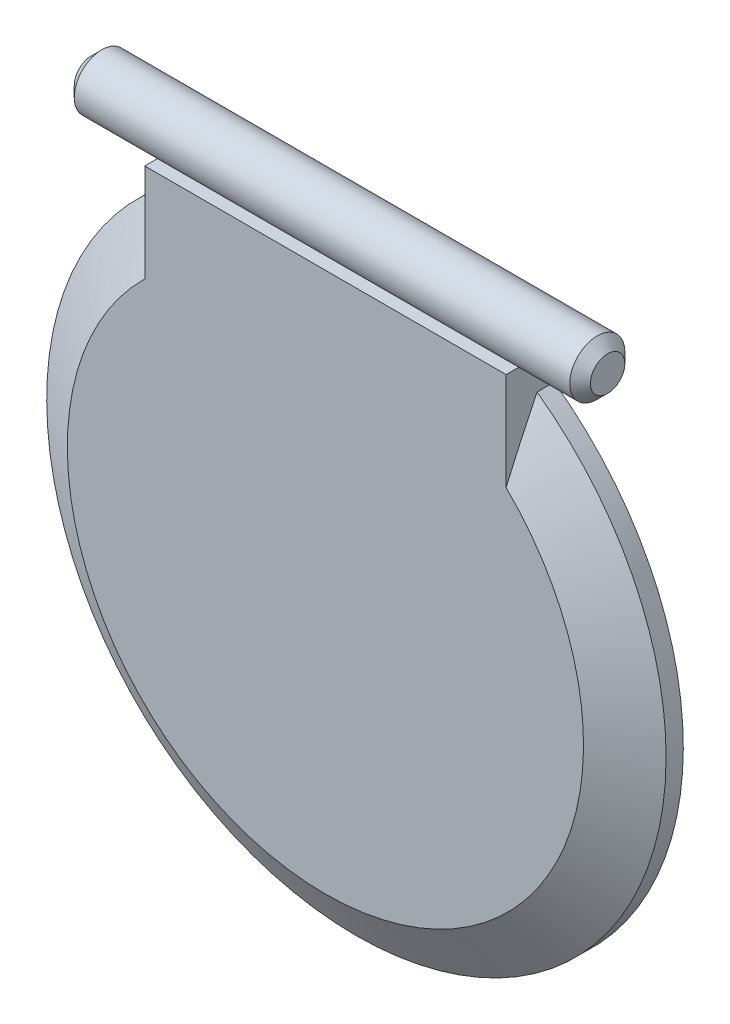
ISO-10303-21;
HEADER;
FILE_DESCRIPTION(('STEP AP214'),'2;1');
FILE_NAME('part.step','',(''),(''),'','','');
FILE_SCHEMA(('AUTOMOTIVE_DESIGN { 1 0 10303 214 1 1 1 1 }'));
ENDSEC;
DATA;
#1=APPLICATION_CONTEXT('core data for automotive mechanical design processes');
#2=APPLICATION_PROTOCOL_DEFINITION('international standard','automotive_design',2000,#1);
#3=PRODUCT_CONTEXT('',#1,'mechanical');
#4=PRODUCT('Part','Part','',(#3));
#5=PRODUCT_RELATED_PRODUCT_CATEGORY('part','',(#4));
#6=PRODUCT_DEFINITION_FORMATION('','',#4);
#7=PRODUCT_DEFINITION_CONTEXT('part definition',#1,'design');
#8=PRODUCT_DEFINITION('design','',#6,#7);
#9=PRODUCT_DEFINITION_SHAPE('','',#8);
#10=(LENGTH_UNIT() NAMED_UNIT(*) SI_UNIT(.MILLI.,.METRE.));
#11=(NAMED_UNIT(*) PLANE_ANGLE_UNIT() SI_UNIT($,.RADIAN.));
#12=(NAMED_UNIT(*) SI_UNIT($,.STERADIAN.) SOLID_ANGLE_UNIT());
#13=UNCERTAINTY_MEASURE_WITH_UNIT(LENGTH_MEASURE(1.E-05),#10,'distance_accuracy_value','');
#14=(GEOMETRIC_REPRESENTATION_CONTEXT(3) GLOBAL_UNCERTAINTY_ASSIGNED_CONTEXT((#13)) GLOBAL_UNIT_ASSIGNED_CONTEXT((#10,
#11,#12)) REPRESENTATION_CONTEXT('',''));
#15=CARTESIAN_POINT('',(0.,0.,0.));
#16=DIRECTION('',(0.,0.,1.));
#17=DIRECTION('',(1.,0.,0.));
#18=AXIS2_PLACEMENT_3D('',#15,#16,#17);
#19=CARTESIAN_POINT('',(120.12741699797,90.,0.));
#20=DIRECTION('',(-1.,0.,0.));
#21=DIRECTION('',(0.,0.,1.));
#22=AXIS2_PLACEMENT_3D('',#19,#20,#21);
#23=CYLINDRICAL_SURFACE('',#22,8.00000000000001);
#24=CARTESIAN_POINT('',(72.,90.,0.));
#25=DIRECTION('',(-1.,0.,0.));
#26=DIRECTION('',(0.,0.,1.));
#27=AXIS2_PLACEMENT_3D('',#24,#25,#26);
#28=CIRCLE('',#27,8.00000000000001);
#29=CARTESIAN_POINT('',(72.,90.,8.00000000000001));
#30=VERTEX_POINT('',#29);
#31=EDGE_CURVE('E60',#30,#30,#28,.T.);
#32=ORIENTED_EDGE('',*,*,#31,.T.);
#33=EDGE_LOOP('',(#32));
#34=FACE_BOUND('',#33,.T.);
#35=CARTESIAN_POINT('',(-72.,90.,0.));
#36=DIRECTION('',(1.,0.,0.));
#37=DIRECTION('',(0.,0.,-1.));
#38=AXIS2_PLACEMENT_3D('',#35,#36,#37);
#39=CIRCLE('',#38,8.00000000000001);
#40=CARTESIAN_POINT('',(-72.,90.,-8.00000000000001));
#41=VERTEX_POINT('',#40);
#42=EDGE_CURVE('E64',#41,#41,#39,.T.);
#43=ORIENTED_EDGE('',*,*,#42,.T.);
#44=EDGE_LOOP('',(#43));
#45=FACE_BOUND('',#44,.T.);
#46=ADVANCED_FACE('F48',(#34,#45),#23,.T.);
#47=CARTESIAN_POINT('',(75.,73.1009575860672,7.));
#48=DIRECTION('',(-1.,0.,0.));
#49=DIRECTION('',(0.,0.,1.));
#50=AXIS2_PLACEMENT_3D('',#47,#48,#49);
#51=PLANE('',#50);
#52=CARTESIAN_POINT('',(75.,90.,0.));
#53=DIRECTION('',(-1.,0.,0.));
#54=DIRECTION('',(0.,0.,1.));
#55=AXIS2_PLACEMENT_3D('',#52,#53,#54);
#56=CIRCLE('',#55,5.00000000000002);
#57=CARTESIAN_POINT('',(75.,90.,5.00000000000001));
#58=VERTEX_POINT('',#57);
#59=EDGE_CURVE('E56',#58,#58,#56,.F.);
#60=ORIENTED_EDGE('',*,*,#59,.T.);
#61=EDGE_LOOP('',(#60));
#62=FACE_BOUND('',#61,.T.);
#63=ADVANCED_FACE('F80',(#62),#51,.F.);
#64=CARTESIAN_POINT('',(-75.,73.1009575860672,7.));
#65=DIRECTION('',(1.,0.,0.));
#66=DIRECTION('',(0.,0.,-1.));
#67=AXIS2_PLACEMENT_3D('',#64,#65,#66);
#68=PLANE('',#67);
#69=CARTESIAN_POINT('',(-75.,90.,0.));
#70=DIRECTION('',(1.,0.,0.));
#71=DIRECTION('',(0.,0.,-1.));
#72=AXIS2_PLACEMENT_3D('',#69,#70,#71);
#73=CIRCLE('',#72,5.);
#74=CARTESIAN_POINT('',(-75.,90.,-5.));
#75=VERTEX_POINT('',#74);
#76=EDGE_CURVE('E11',#75,#75,#73,.F.);
#77=ORIENTED_EDGE('',*,*,#76,.T.);
#78=EDGE_LOOP('',(#77));
#79=FACE_BOUND('',#78,.T.);
#80=ADVANCED_FACE('F77',(#79),#68,.F.);
#81=CARTESIAN_POINT('',(72.,90.,0.));
#82=DIRECTION('',(-1.,0.,0.));
#83=DIRECTION('',(0.,0.,1.));
#84=AXIS2_PLACEMENT_3D('',#81,#82,#83);
#85=CONICAL_SURFACE('',#84,8.00000000000001,0.785398163397452);
#86=CARTESIAN_POINT('',(75.,90.,5.00000000000001));
#87=CARTESIAN_POINT('',(74.96875,90.,5.03125000000001));
#88=CARTESIAN_POINT('',(74.9375,90.,5.06250000000001));
#89=CARTESIAN_POINT('',(74.875,90.,5.12500000000001));
#90=CARTESIAN_POINT('',(74.84375,90.,5.15625000000001));
#91=CARTESIAN_POINT('',(74.78125,90.,5.21875000000001));
#92=CARTESIAN_POINT('',(74.75,90.,5.25000000000001));
#93=CARTESIAN_POINT('',(74.6875,90.,5.31250000000001));
#94=CARTESIAN_POINT('',(74.65625,90.,5.34375000000001));
#95=CARTESIAN_POINT('',(74.59375,90.,5.40625000000001));
#96=CARTESIAN_POINT('',(74.5625,90.,5.43750000000001));
#97=CARTESIAN_POINT('',(74.5,90.,5.50000000000001));
#98=CARTESIAN_POINT('',(74.46875,90.,5.53125000000001));
#99=CARTESIAN_POINT('',(74.40625,90.,5.59375000000001));
#100=CARTESIAN_POINT('',(74.375,90.,5.62500000000001));
#101=CARTESIAN_POINT('',(74.3125,90.,5.68750000000001));
#102=CARTESIAN_POINT('',(74.28125,90.,5.71875000000001));
#103=CARTESIAN_POINT('',(74.21875,90.,5.78125000000001));
#104=CARTESIAN_POINT('',(74.1875,90.,5.81250000000001));
#105=CARTESIAN_POINT('',(74.125,90.,5.87500000000001));
#106=CARTESIAN_POINT('',(74.09375,90.,5.90625000000001));
#107=CARTESIAN_POINT('',(74.03125,90.,5.96875000000001));
#108=CARTESIAN_POINT('',(74.,90.,6.00000000000001));
#109=CARTESIAN_POINT('',(73.9375,90.,6.06250000000001));
#110=CARTESIAN_POINT('',(73.90625,90.,6.09375000000001));
#111=CARTESIAN_POINT('',(73.84375,90.,6.15625000000001));
#112=CARTESIAN_POINT('',(73.8125,90.,6.18750000000001));
#113=CARTESIAN_POINT('',(73.75,90.,6.25000000000001));
#114=CARTESIAN_POINT('',(73.71875,90.,6.28125000000001));
#115=CARTESIAN_POINT('',(73.65625,90.,6.34375000000001));
#116=CARTESIAN_POINT('',(73.625,90.,6.37500000000001));
#117=CARTESIAN_POINT('',(73.5625,90.,6.43750000000001));
#118=CARTESIAN_POINT('',(73.53125,90.,6.46875000000001));
#119=CARTESIAN_POINT('',(73.46875,90.,6.53125000000001));
#120=CARTESIAN_POINT('',(73.4375,90.,6.56250000000001));
#121=CARTESIAN_POINT('',(73.375,90.,6.62500000000001));
#122=CARTESIAN_POINT('',(73.34375,90.,6.65625000000001));
#123=CARTESIAN_POINT('',(73.28125,90.,6.71875000000001));
#124=CARTESIAN_POINT('',(73.25,90.,6.75000000000001));
#125=CARTESIAN_POINT('',(73.1875,90.,6.81250000000001));
#126=CARTESIAN_POINT('',(73.15625,90.,6.84375000000001));
#127=CARTESIAN_POINT('',(73.09375,90.,6.90625000000001));
#128=CARTESIAN_POINT('',(73.0625,90.,6.93750000000001));
#129=CARTESIAN_POINT('',(73.,90.,7.00000000000001));
#130=CARTESIAN_POINT('',(72.96875,90.,7.03125000000001));
#131=CARTESIAN_POINT('',(72.90625,90.,7.09375000000001));
#132=CARTESIAN_POINT('',(72.875,90.,7.12500000000001));
#133=CARTESIAN_POINT('',(72.8125,90.,7.18750000000001));
#134=CARTESIAN_POINT('',(72.78125,90.,7.21875000000001));
#135=CARTESIAN_POINT('',(72.71875,90.,7.28125000000001));
#136=CARTESIAN_POINT('',(72.6875,90.,7.31250000000001));
#137=CARTESIAN_POINT('',(72.625,90.,7.37500000000001));
#138=CARTESIAN_POINT('',(72.59375,90.,7.40625000000001));
#139=CARTESIAN_POINT('',(72.53125,90.,7.46875000000001));
#140=CARTESIAN_POINT('',(72.5,90.,7.50000000000001));
#141=CARTESIAN_POINT('',(72.4375,90.,7.56250000000001));
#142=CARTESIAN_POINT('',(72.40625,90.,7.59375000000001));
#143=CARTESIAN_POINT('',(72.34375,90.,7.65625000000001));
#144=CARTESIAN_POINT('',(72.3125,90.,7.68750000000001));
#145=CARTESIAN_POINT('',(72.25,90.,7.75000000000001));
#146=CARTESIAN_POINT('',(72.21875,90.,7.78125000000001));
#147=CARTESIAN_POINT('',(72.15625,90.,7.84375000000001));
#148=CARTESIAN_POINT('',(72.125,90.,7.87500000000001));
#149=CARTESIAN_POINT('',(72.0625,90.,7.93750000000001));
#150=CARTESIAN_POINT('',(72.03125,90.,7.96875000000001));
#151=CARTESIAN_POINT('',(72.,90.,8.00000000000001));
#152=B_SPLINE_CURVE_WITH_KNOTS('',3,(#86,#87,#88,#89,#90,#91,#92,#93,#94,#95,#96,#97,#98,#99,
#100,#101,#102,#103,#104,#105,#106,#107,#108,#109,#110,#111,#112,#113,#114,#115,#116,#117,#118,
#119,#120,#121,#122,#123,#124,#125,#126,#127,#128,#129,#130,#131,#132,#133,#134,#135,#136,#137,
#138,#139,#140,#141,#142,#143,#144,#145,#146,#147,#148,#149,#150,#151),.UNSPECIFIED.,.F.,.F.,(4,
2,2,2,2,2,2,2,2,2,2,2,2,2,2,2,2,2,2,2,2,2,2,2,2,2,2,2,2,2,2,2,4),(0.,0.13258252147247,
0.265165042944951,0.397747564417431,0.530330085889901,0.662912607362381,0.795495128834861,
0.928077650307331,1.06066017177981,1.19324269325229,1.32582521472476,1.45840773619724,
1.59099025766972,1.72357277914219,1.85615530061467,1.98873782208715,2.12132034355963,
2.2539028650321,2.38648538650458,2.51906790797706,2.65165042944953,2.78423295092201,
2.91681547239449,3.04939799386696,3.18198051533944,3.31456303681192,3.44714555828439,
3.57972807975687,3.71231060122935,3.84489312270182,3.9774756441743,4.11005816564678,
4.24264068711927),.UNSPECIFIED.);
#153=EDGE_CURVE('BSEAM73',#58,#30,#152,.T.);
#154=ORIENTED_EDGE('',*,*,#59,.F.);
#155=ORIENTED_EDGE('',*,*,#31,.F.);
#156=ORIENTED_EDGE('',*,*,#153,.T.);
#157=ORIENTED_EDGE('',*,*,#153,.F.);
#158=EDGE_LOOP('',(#154,#156,#155,#157));
#159=FACE_BOUND('',#158,.T.);
#160=ADVANCED_FACE('F73',(#159),#85,.T.);
#161=CARTESIAN_POINT('',(-75.,90.,0.));
#162=DIRECTION('',(1.,0.,0.));
#163=DIRECTION('',(0.,0.,-1.));
#164=AXIS2_PLACEMENT_3D('',#161,#162,#163);
#165=CONICAL_SURFACE('',#164,5.00000000000002,0.785398163397447);
#166=ORIENTED_EDGE('',*,*,#42,.F.);
#167=EDGE_LOOP('',(#166));
#168=FACE_BOUND('',#167,.T.);
#169=ORIENTED_EDGE('',*,*,#76,.F.);
#170=EDGE_LOOP('',(#169));
#171=FACE_BOUND('',#170,.T.);
#172=ADVANCED_FACE('F51',(#168,#171),#165,.T.);
#173=CLOSED_SHELL('',(#46,#63,#80,#160,#172));
#174=MANIFOLD_SOLID_BREP('B2',#173);
#175=CARTESIAN_POINT('',(0.,0.,7.));
#176=DIRECTION('',(0.,0.,-1.));
#177=DIRECTION('',(-1.,0.,0.));
#178=AXIS2_PLACEMENT_3D('',#175,#176,#177);
#179=CYLINDRICAL_SURFACE('',#178,90.);
#180=CARTESIAN_POINT('',(0.,0.,-2.));
#181=DIRECTION('',(0.,0.,1.));
#182=DIRECTION('',(1.,0.,0.));
#183=AXIS2_PLACEMENT_3D('',#180,#181,#182);
#184=CIRCLE('',#183,90.);
#185=CARTESIAN_POINT('',(-52.5,73.1009575860672,-1.99999999999999));
#186=VERTEX_POINT('',#185);
#187=CARTESIAN_POINT('',(52.5,73.1009575860672,-1.99999999999999));
#188=VERTEX_POINT('',#187);
#189=EDGE_CURVE('E171',#186,#188,#184,.T.);
#190=ORIENTED_EDGE('',*,*,#189,.F.);
#191=DIRECTION('',(0.,0.,-1.));
#192=VECTOR('',#191,1.);
#193=CARTESIAN_POINT('',(-52.5,73.1009575860672,7.));
#194=LINE('',#193,#192);
#195=CARTESIAN_POINT('',(-52.5,73.1009575860672,-7.));
#196=VERTEX_POINT('',#195);
#197=EDGE_CURVE('E165',#186,#196,#194,.T.);
#198=ORIENTED_EDGE('',*,*,#197,.T.);
#199=CARTESIAN_POINT('',(0.,0.,-7.));
#200=DIRECTION('',(0.,0.,1.));
#201=DIRECTION('',(1.,0.,0.));
#202=AXIS2_PLACEMENT_3D('',#199,#200,#201);
#203=CIRCLE('',#202,90.);
#204=CARTESIAN_POINT('',(52.5,73.1009575860672,-7.));
#205=VERTEX_POINT('',#204);
#206=EDGE_CURVE('E169',#196,#205,#203,.T.);
#207=ORIENTED_EDGE('',*,*,#206,.T.);
#208=DIRECTION('',(0.,0.,-1.));
#209=VECTOR('',#208,1.);
#210=CARTESIAN_POINT('',(52.5,73.1009575860672,7.));
#211=LINE('',#210,#209);
#212=EDGE_CURVE('E46',#188,#205,#211,.T.);
#213=ORIENTED_EDGE('',*,*,#212,.F.);
#214=EDGE_LOOP('',(#190,#198,#207,#213));
#215=FACE_BOUND('',#214,.T.);
#216=ADVANCED_FACE('F126',(#215),#179,.T.);
#217=CARTESIAN_POINT('',(-52.5,82.,7.));
#218=DIRECTION('',(0.,-1.,0.));
#219=DIRECTION('',(0.,0.,-1.));
#220=AXIS2_PLACEMENT_3D('',#217,#218,#219);
#221=PLANE('',#220);
#222=DIRECTION('',(0.,0.,-1.));
#223=VECTOR('',#222,1.);
#224=CARTESIAN_POINT('',(-52.5,82.,7.));
#225=LINE('',#224,#223);
#226=CARTESIAN_POINT('',(-52.5,82.,7.));
#227=VERTEX_POINT('',#226);
#228=CARTESIAN_POINT('',(-52.5,82.,-7.));
#229=VERTEX_POINT('',#228);
#230=EDGE_CURVE('E173',#227,#229,#225,.T.);
#231=ORIENTED_EDGE('',*,*,#230,.F.);
#232=DIRECTION('',(-1.,0.,0.));
#233=VECTOR('',#232,1.);
#234=CARTESIAN_POINT('',(-52.5,82.,7.));
#235=LINE('',#234,#233);
#236=CARTESIAN_POINT('',(52.5,82.,7.));
#237=VERTEX_POINT('',#236);
#238=EDGE_CURVE('E146',#237,#227,#235,.T.);
#239=ORIENTED_EDGE('',*,*,#238,.F.);
#240=DIRECTION('',(0.,0.,-1.));
#241=VECTOR('',#240,1.);
#242=CARTESIAN_POINT('',(52.5,82.,7.));
#243=LINE('',#242,#241);
#244=CARTESIAN_POINT('',(52.5,82.,-7.));
#245=VERTEX_POINT('',#244);
#246=EDGE_CURVE('E133',#237,#245,#243,.T.);
#247=ORIENTED_EDGE('',*,*,#246,.T.);
#248=DIRECTION('',(-1.,0.,0.));
#249=VECTOR('',#248,1.);
#250=CARTESIAN_POINT('',(-52.5,82.,-7.));
#251=LINE('',#250,#249);
#252=EDGE_CURVE('E182',#245,#229,#251,.T.);
#253=ORIENTED_EDGE('',*,*,#252,.T.);
#254=EDGE_LOOP('',(#231,#239,#247,#253));
#255=FACE_BOUND('',#254,.T.);
#256=ADVANCED_FACE('F198',(#255),#221,.F.);
#257=CARTESIAN_POINT('',(52.5,73.1009575860672,7.));
#258=DIRECTION('',(-1.,0.,0.));
#259=DIRECTION('',(0.,0.,1.));
#260=AXIS2_PLACEMENT_3D('',#257,#258,#259);
#261=PLANE('',#260);
#262=DIRECTION('',(0.,1.,0.));
#263=VECTOR('',#262,1.);
#264=CARTESIAN_POINT('',(52.5,73.1009575860672,-7.));
#265=LINE('',#264,#263);
#266=EDGE_CURVE('E186',#205,#245,#265,.T.);
#267=ORIENTED_EDGE('',*,*,#266,.T.);
#268=ORIENTED_EDGE('',*,*,#246,.F.);
#269=DIRECTION('',(0.,1.,0.));
#270=VECTOR('',#269,1.);
#271=CARTESIAN_POINT('',(52.5,73.1009575860672,7.));
#272=LINE('',#271,#270);
#273=CARTESIAN_POINT('',(52.5,53.5607132140714,7.));
#274=VERTEX_POINT('',#273);
#275=EDGE_CURVE('E181',#274,#237,#272,.T.);
#276=ORIENTED_EDGE('',*,*,#275,.F.);
#277=CARTESIAN_POINT('',(52.5,23.7311144120121,17.4313771630259));
#278=CARTESIAN_POINT('',(52.5,25.0072695056273,17.1159517616806));
#279=CARTESIAN_POINT('',(52.5,26.2783971259705,16.7807197640386));
#280=CARTESIAN_POINT('',(52.5,28.8105483478798,16.0748841874146));
#281=CARTESIAN_POINT('',(52.5,30.0715738560886,15.7042874620946));
#282=CARTESIAN_POINT('',(52.5,32.5828308959813,14.9321875688029));
#283=CARTESIAN_POINT('',(52.5,33.8330711465397,14.5307126121496));
#284=CARTESIAN_POINT('',(52.5,36.3244325563963,13.700249402092));
#285=CARTESIAN_POINT('',(52.5,37.5655532198947,13.2712596649624));
#286=CARTESIAN_POINT('',(52.5,40.0360650871365,12.3902184145461));
#287=CARTESIAN_POINT('',(52.5,41.2654778447492,11.938227178619));
#288=CARTESIAN_POINT('',(52.5,43.7163279752457,11.0131045081176));
#289=CARTESIAN_POINT('',(52.5,44.937765228359,10.5399727569032));
#290=CARTESIAN_POINT('',(52.5,47.3735583958517,9.57500492730604));
#291=CARTESIAN_POINT('',(52.5,48.5879125192038,9.08316433619357));
#292=CARTESIAN_POINT('',(52.5,51.0098517202688,8.08310217882679));
#293=CARTESIAN_POINT('',(52.5,52.2174367726144,7.57488055123216));
#294=CARTESIAN_POINT('',(52.5,54.6221854686307,6.54579060312351));
#295=CARTESIAN_POINT('',(52.5,55.8193708127658,6.02497292457712));
#296=CARTESIAN_POINT('',(52.5,58.2081259125659,4.97063361253167));
#297=CARTESIAN_POINT('',(52.5,59.3996956766982,4.43711199819505));
#298=CARTESIAN_POINT('',(52.5,61.7776041801638,3.35884608979392));
#299=CARTESIAN_POINT('',(52.5,62.9639434093341,2.81410287494495));
#300=CARTESIAN_POINT('',(52.5,65.3319670730536,1.7145814971719));
#301=CARTESIAN_POINT('',(52.5,66.5136514797868,1.15980327439158));
#302=CARTESIAN_POINT('',(52.5,68.8735433865782,0.0409296462947446));
#303=CARTESIAN_POINT('',(52.5,70.0517481133499,-0.523171604843227));
#304=CARTESIAN_POINT('',(52.5,72.4042812740732,-1.65940376032818));
#305=CARTESIAN_POINT('',(52.5,73.5786096920347,-2.23153469774716));
#306=CARTESIAN_POINT('',(52.5,77.0963254730621,-3.95872008844091));
#307=CARTESIAN_POINT('',(52.5,79.4344246180922,-5.1245581998316));
#308=CARTESIAN_POINT('',(52.5,83.0293800436118,-6.93962336622893));
#309=CARTESIAN_POINT('',(52.5,84.2904163730013,-7.58060583104208));
#310=CARTESIAN_POINT('',(52.5,86.8093228480436,-8.8687340349144));
#311=CARTESIAN_POINT('',(52.5,88.0671930251225,-9.51587971249237));
#312=CARTESIAN_POINT('',(52.5,91.8358802882312,-11.4652992958172));
#313=CARTESIAN_POINT('',(52.5,94.3424044207839,-12.7758747834155));
#314=CARTESIAN_POINT('',(52.5,99.3500194403884,-15.4172862426868));
#315=CARTESIAN_POINT('',(52.5,101.851094574246,-16.7481520346088));
#316=CARTESIAN_POINT('',(52.5,105.596959470412,-18.7558851910323));
#317=CARTESIAN_POINT('',(52.5,106.844774072208,-19.4271173953505));
#318=CARTESIAN_POINT('',(52.5,109.338542186537,-20.7730263018932));
#319=CARTESIAN_POINT('',(52.5,110.584495701663,-21.4477029993095));
#320=CARTESIAN_POINT('',(52.5,111.829598802059,-22.1239455274922));
#321=B_SPLINE_CURVE_WITH_KNOTS('',3,(#277,#278,#279,#280,#281,#282,#283,#284,#285,#286,#287,
#288,#289,#290,#291,#292,#293,#294,#295,#296,#297,#298,#299,#300,#301,#302,#303,#304,#305,#306,
#307,#308,#309,#310,#311,#312,#313,#314,#315,#316,#317,#318,#319,#320),.UNSPECIFIED.,.F.,.F.,(4,
2,2,2,2,2,2,2,2,2,2,2,2,2,2,2,2,2,2,2,2,4),(0.,3.94333199910918,7.88590132901232,
11.8249104422802,15.7641321441604,19.69351489786,23.6229565251108,27.5533520529651,
31.4837623002602,35.400379053674,39.3169898996899,43.233225815782,47.1494850989183,
51.0683009080212,54.9871328623509,62.8248590448098,67.068623933841,71.3123465334016,
79.7976724533905,88.2969770638975,92.5476602048708,96.7983374139379),.UNSPECIFIED.);
#322=EDGE_CURVE('E206',#274,#188,#321,.T.);
#323=ORIENTED_EDGE('',*,*,#322,.T.);
#324=ORIENTED_EDGE('',*,*,#212,.T.);
#325=EDGE_LOOP('',(#267,#268,#276,#323,#324));
#326=FACE_BOUND('',#325,.T.);
#327=ADVANCED_FACE('F201',(#326),#261,.F.);
#328=CARTESIAN_POINT('',(-52.5,73.1009575860672,7.));
#329=DIRECTION('',(1.,0.,0.));
#330=DIRECTION('',(0.,0.,-1.));
#331=AXIS2_PLACEMENT_3D('',#328,#329,#330);
#332=PLANE('',#331);
#333=DIRECTION('',(0.,-1.,0.));
#334=VECTOR('',#333,1.);
#335=CARTESIAN_POINT('',(-52.5,73.1009575860672,-7.));
#336=LINE('',#335,#334);
#337=EDGE_CURVE('E177',#229,#196,#336,.T.);
#338=ORIENTED_EDGE('',*,*,#337,.T.);
#339=ORIENTED_EDGE('',*,*,#197,.F.);
#340=CARTESIAN_POINT('',(-52.5,111.829598802059,-22.1239455274922));
#341=CARTESIAN_POINT('',(-52.5,110.058091810096,-21.1618286216945));
#342=CARTESIAN_POINT('',(-52.5,108.284877354412,-20.2028456216322));
#343=CARTESIAN_POINT('',(-52.5,104.734531862858,-18.2921252831437));
#344=CARTESIAN_POINT('',(-52.5,102.957400796355,-17.3403880016485));
#345=CARTESIAN_POINT('',(-52.5,99.3989684994454,-15.445269396956));
#346=CARTESIAN_POINT('',(-52.5,97.6176678125279,-14.5018870539039));
#347=CARTESIAN_POINT('',(-52.5,94.0500899103924,-12.6245807784568));
#348=CARTESIAN_POINT('',(-52.5,92.2638127025557,-11.6906568320423));
#349=CARTESIAN_POINT('',(-52.5,88.6910132434577,-9.83652607844489));
#350=CARTESIAN_POINT('',(-52.5,86.9045081179276,-8.91628629452222));
#351=CARTESIAN_POINT('',(-52.5,83.3250729571258,-7.0883790242716));
#352=CARTESIAN_POINT('',(-52.5,81.532142923744,-6.180711534246));
#353=CARTESIAN_POINT('',(-52.5,77.9385241144879,-4.37984761384295));
#354=CARTESIAN_POINT('',(-52.5,76.1378337059345,-3.486654437786));
#355=CARTESIAN_POINT('',(-52.5,72.5279855201671,-1.71750889960569));
#356=CARTESIAN_POINT('',(-52.5,70.7188277072879,-0.841556610183017));
#357=CARTESIAN_POINT('',(-52.5,67.0845089721127,0.892946958056262));
#358=CARTESIAN_POINT('',(-52.5,65.2593143886072,1.75142788378178));
#359=CARTESIAN_POINT('',(-52.5,62.5130517839483,3.02076977303686));
#360=CARTESIAN_POINT('',(-52.5,61.5962261821906,3.44081733934132));
#361=CARTESIAN_POINT('',(-52.5,59.7595083319592,4.27420383317107));
#362=CARTESIAN_POINT('',(-52.5,58.8396160187772,4.68754261804537));
#363=CARTESIAN_POINT('',(-52.5,56.0759984837215,5.91611315906524));
#364=CARTESIAN_POINT('',(-52.5,54.2273611657776,6.72034966267315));
#365=CARTESIAN_POINT('',(-52.5,50.5150907998606,8.29339719815562));
#366=CARTESIAN_POINT('',(-52.5,48.6514581610486,9.06220919279615));
#367=CARTESIAN_POINT('',(-52.5,44.900763410291,10.5593188528268));
#368=CARTESIAN_POINT('',(-52.5,43.0136440884589,11.2874736777861));
#369=CARTESIAN_POINT('',(-52.5,39.2200236536254,12.6909329884728));
#370=CARTESIAN_POINT('',(-52.5,37.3135255824395,13.3662456282133));
#371=CARTESIAN_POINT('',(-52.5,34.4357642989461,14.3314718937159));
#372=CARTESIAN_POINT('',(-52.5,33.4725762941012,14.6455349267096));
#373=CARTESIAN_POINT('',(-52.5,31.5405655226311,15.2557802050504));
#374=CARTESIAN_POINT('',(-52.5,30.5717429140372,15.5519629492521));
#375=CARTESIAN_POINT('',(-52.5,28.6277701597099,16.1248067215419));
#376=CARTESIAN_POINT('',(-52.5,27.6526169421861,16.4014573560662));
#377=CARTESIAN_POINT('',(-52.5,25.696336760302,16.9331344865111));
#378=CARTESIAN_POINT('',(-52.5,24.7152092139009,17.1881588381904));
#379=CARTESIAN_POINT('',(-52.5,23.7311144120121,17.431377163026));
#380=B_SPLINE_CURVE_WITH_KNOTS('',3,(#340,#341,#342,#343,#344,#345,#346,#347,#348,#349,#350,
#351,#352,#353,#354,#355,#356,#357,#358,#359,#360,#361,#362,#363,#364,#365,#366,#367,#368,#369,
#370,#371,#372,#373,#374,#375,#376,#377,#378,#379),.UNSPECIFIED.,.F.,.F.,(4,2,2,2,2,2,2,2,2,2,2,
2,2,2,2,2,2,2,2,4),(0.,6.04774347164726,12.095534412605,18.1425766564238,24.1896099358535,
30.2183296559069,36.2470476028033,42.2771027138824,48.3071832468087,54.3580401822901,
57.383422305675,60.4088686746757,66.4565490594916,72.5040649836111,78.5716399287724,
84.6382767398752,87.6774267987421,90.7164920270479,93.7571624221501,96.7981339474076),.UNSPECIFIED.);
#381=CARTESIAN_POINT('',(-52.5,53.5607132140714,7.));
#382=VERTEX_POINT('',#381);
#383=EDGE_CURVE('E212',#186,#382,#380,.T.);
#384=ORIENTED_EDGE('',*,*,#383,.T.);
#385=DIRECTION('',(0.,-1.,0.));
#386=VECTOR('',#385,1.);
#387=CARTESIAN_POINT('',(-52.5,73.1009575860672,7.));
#388=LINE('',#387,#386);
#389=EDGE_CURVE('E140',#227,#382,#388,.T.);
#390=ORIENTED_EDGE('',*,*,#389,.F.);
#391=ORIENTED_EDGE('',*,*,#230,.T.);
#392=EDGE_LOOP('',(#338,#339,#384,#390,#391));
#393=FACE_BOUND('',#392,.T.);
#394=ADVANCED_FACE('F178',(#393),#332,.F.);
#395=CARTESIAN_POINT('',(0.,0.,-7.));
#396=DIRECTION('',(0.,0.,1.));
#397=DIRECTION('',(1.,0.,0.));
#398=AXIS2_PLACEMENT_3D('',#395,#396,#397);
#399=PLANE('',#398);
#400=ORIENTED_EDGE('',*,*,#266,.F.);
#401=ORIENTED_EDGE('',*,*,#206,.F.);
#402=ORIENTED_EDGE('',*,*,#337,.F.);
#403=ORIENTED_EDGE('',*,*,#252,.F.);
#404=EDGE_LOOP('',(#400,#401,#402,#403));
#405=FACE_BOUND('',#404,.T.);
#406=ADVANCED_FACE('F185',(#405),#399,.F.);
#407=CARTESIAN_POINT('',(0.,0.,7.));
#408=DIRECTION('',(0.,0.,-1.));
#409=DIRECTION('',(-1.,0.,0.));
#410=AXIS2_PLACEMENT_3D('',#407,#408,#409);
#411=CONICAL_SURFACE('',#410,75.,1.03037682652431);
#412=ORIENTED_EDGE('',*,*,#383,.F.);
#413=ORIENTED_EDGE('',*,*,#189,.T.);
#414=ORIENTED_EDGE('',*,*,#322,.F.);
#415=CARTESIAN_POINT('',(0.,0.,7.));
#416=DIRECTION('',(0.,0.,1.));
#417=DIRECTION('',(1.,0.,0.));
#418=AXIS2_PLACEMENT_3D('',#415,#416,#417);
#419=CIRCLE('',#418,75.);
#420=EDGE_CURVE('E189',#382,#274,#419,.T.);
#421=ORIENTED_EDGE('',*,*,#420,.F.);
#422=EDGE_LOOP('',(#412,#413,#414,#421));
#423=FACE_BOUND('',#422,.T.);
#424=ADVANCED_FACE('F213',(#423),#411,.T.);
#425=CARTESIAN_POINT('',(0.,0.,7.));
#426=DIRECTION('',(0.,0.,1.));
#427=DIRECTION('',(1.,0.,0.));
#428=AXIS2_PLACEMENT_3D('',#425,#426,#427);
#429=PLANE('',#428);
#430=ORIENTED_EDGE('',*,*,#420,.T.);
#431=ORIENTED_EDGE('',*,*,#275,.T.);
#432=ORIENTED_EDGE('',*,*,#238,.T.);
#433=ORIENTED_EDGE('',*,*,#389,.T.);
#434=EDGE_LOOP('',(#430,#431,#432,#433));
#435=FACE_BOUND('',#434,.T.);
#436=ADVANCED_FACE('F233',(#435),#429,.T.);
#437=CLOSED_SHELL('',(#216,#256,#327,#394,#406,#424,#436));
#438=MANIFOLD_SOLID_BREP('B6',#437);
#439=ADVANCED_BREP_SHAPE_REPRESENTATION('',(#18,#174,#438),#14);
#440=SHAPE_DEFINITION_REPRESENTATION(#9,#439);
ENDSEC;
END-ISO-10303-21;
